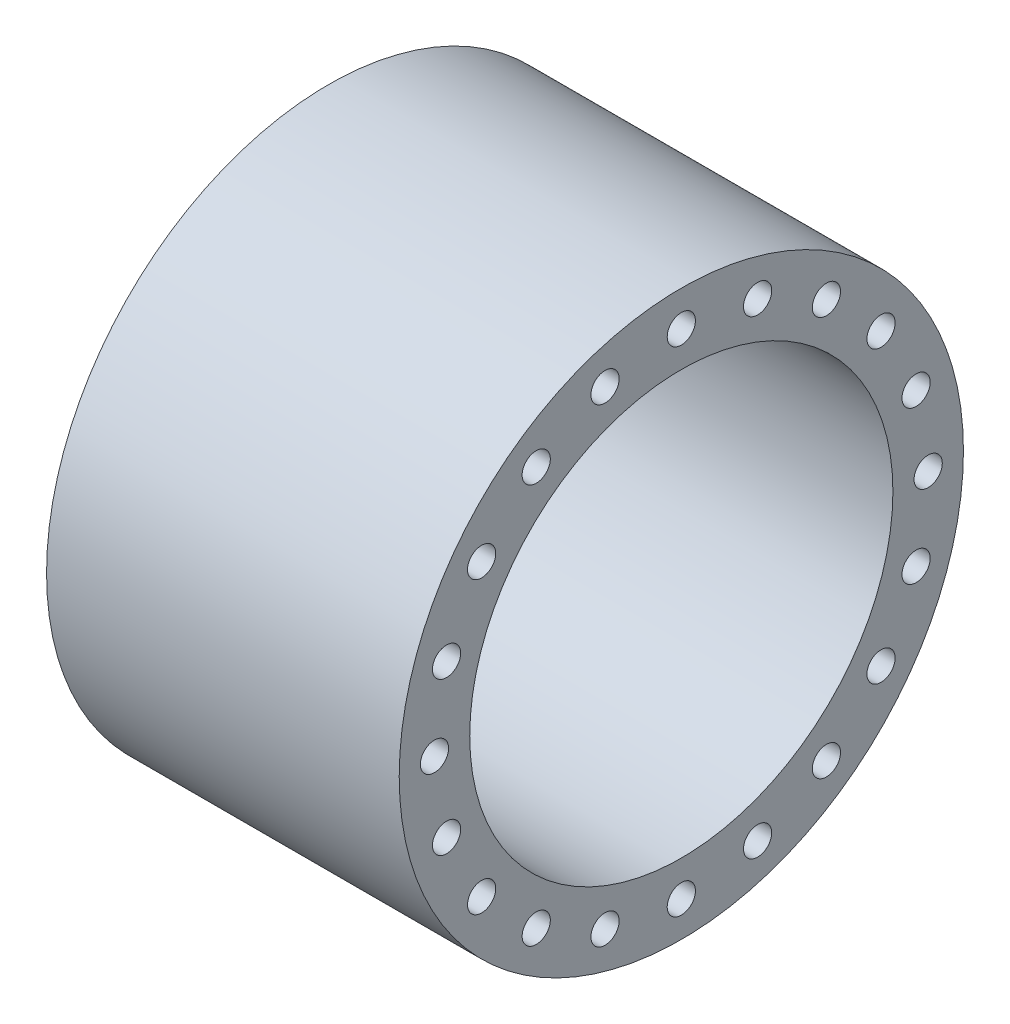
ISO-10303-21;
HEADER;
FILE_DESCRIPTION(('STEP AP214'),'2;1');
FILE_NAME('part.step','',(''),(''),'','','');
FILE_SCHEMA(('AUTOMOTIVE_DESIGN { 1 0 10303 214 1 1 1 1 }'));
ENDSEC;
DATA;
#1=APPLICATION_CONTEXT('core data for automotive mechanical design processes');
#2=APPLICATION_PROTOCOL_DEFINITION('international standard','automotive_design',2000,#1);
#3=PRODUCT_CONTEXT('',#1,'mechanical');
#4=PRODUCT('Part','Part','',(#3));
#5=PRODUCT_RELATED_PRODUCT_CATEGORY('part','',(#4));
#6=PRODUCT_DEFINITION_FORMATION('','',#4);
#7=PRODUCT_DEFINITION_CONTEXT('part definition',#1,'design');
#8=PRODUCT_DEFINITION('design','',#6,#7);
#9=PRODUCT_DEFINITION_SHAPE('','',#8);
#10=(LENGTH_UNIT() NAMED_UNIT(*) SI_UNIT(.MILLI.,.METRE.));
#11=(NAMED_UNIT(*) PLANE_ANGLE_UNIT() SI_UNIT($,.RADIAN.));
#12=(NAMED_UNIT(*) SI_UNIT($,.STERADIAN.) SOLID_ANGLE_UNIT());
#13=UNCERTAINTY_MEASURE_WITH_UNIT(LENGTH_MEASURE(1.E-05),#10,'distance_accuracy_value','');
#14=(GEOMETRIC_REPRESENTATION_CONTEXT(3) GLOBAL_UNCERTAINTY_ASSIGNED_CONTEXT((#13)) GLOBAL_UNIT_ASSIGNED_CONTEXT((#10,
#11,#12)) REPRESENTATION_CONTEXT('',''));
#15=CARTESIAN_POINT('',(0.,0.,0.));
#16=DIRECTION('',(0.,0.,1.));
#17=DIRECTION('',(1.,0.,0.));
#18=AXIS2_PLACEMENT_3D('',#15,#16,#17);
#19=CARTESIAN_POINT('',(50.,0.,0.));
#20=DIRECTION('',(1.,0.,0.));
#21=DIRECTION('',(0.,0.,1.));
#22=AXIS2_PLACEMENT_3D('',#19,#20,#21);
#23=PLANE('',#22);
#24=CARTESIAN_POINT('',(50.,66.573956140661,-21.6311896062454));
#25=DIRECTION('',(-1.,0.,0.));
#26=DIRECTION('',(0.,0.309016994374935,0.951056516295158));
#27=AXIS2_PLACEMENT_3D('',#24,#25,#26);
#28=CIRCLE('',#27,4.);
#29=CARTESIAN_POINT('',(50.,67.8100241181608,-17.8269635410648));
#30=VERTEX_POINT('',#29);
#31=EDGE_CURVE('E175',#30,#30,#28,.T.);
#32=ORIENTED_EDGE('',*,*,#31,.T.);
#33=EDGE_LOOP('',(#32));
#34=FACE_BOUND('',#33,.T.);
#35=CARTESIAN_POINT('',(50.,56.6311896062469,-41.1449676604724));
#36=DIRECTION('',(-1.,0.,0.));
#37=DIRECTION('',(0.,0.587785252292462,0.809016994374955));
#38=AXIS2_PLACEMENT_3D('',#35,#36,#37);
#39=CIRCLE('',#38,4.);
#40=CARTESIAN_POINT('',(50.,58.9823306154167,-37.9088996829726));
#41=VERTEX_POINT('',#40);
#42=EDGE_CURVE('E169',#41,#41,#39,.T.);
#43=ORIENTED_EDGE('',*,*,#42,.T.);
#44=EDGE_LOOP('',(#43));
#45=FACE_BOUND('',#44,.T.);
#46=CARTESIAN_POINT('',(50.,41.1449676604738,-56.6311896062458));
#47=DIRECTION('',(-1.,0.,0.));
#48=DIRECTION('',(0.,0.80901699437494,0.587785252292483));
#49=AXIS2_PLACEMENT_3D('',#46,#47,#48);
#50=CIRCLE('',#49,4.);
#51=CARTESIAN_POINT('',(50.,44.3810356379736,-54.2800485970759));
#52=VERTEX_POINT('',#51);
#53=EDGE_CURVE('E163',#52,#52,#50,.T.);
#54=ORIENTED_EDGE('',*,*,#53,.T.);
#55=EDGE_LOOP('',(#54));
#56=FACE_BOUND('',#55,.T.);
#57=CARTESIAN_POINT('',(50.,21.6311896062471,-66.5739561406605));
#58=DIRECTION('',(-1.,0.,0.));
#59=DIRECTION('',(0.,0.95105651629515,0.309016994374958));
#60=AXIS2_PLACEMENT_3D('',#57,#58,#59);
#61=CIRCLE('',#60,4.);
#62=CARTESIAN_POINT('',(50.,25.4354156714277,-65.3378881631607));
#63=VERTEX_POINT('',#62);
#64=EDGE_CURVE('E157',#63,#63,#61,.T.);
#65=ORIENTED_EDGE('',*,*,#64,.T.);
#66=EDGE_LOOP('',(#65));
#67=FACE_BOUND('',#66,.T.);
#68=CARTESIAN_POINT('',(50.,7.368850215545E-13,-70.));
#69=DIRECTION('',(-1.,0.,0.));
#70=DIRECTION('',(0.,1.,0.));
#71=AXIS2_PLACEMENT_3D('',#68,#69,#70);
#72=CIRCLE('',#71,4.);
#73=CARTESIAN_POINT('',(50.,4.00000000000074,-70.));
#74=VERTEX_POINT('',#73);
#75=EDGE_CURVE('E151',#74,#74,#72,.T.);
#76=ORIENTED_EDGE('',*,*,#75,.T.);
#77=EDGE_LOOP('',(#76));
#78=FACE_BOUND('',#77,.T.);
#79=CARTESIAN_POINT('',(50.,-21.6311896062457,-66.573956140661));
#80=DIRECTION('',(-1.,0.,0.));
#81=DIRECTION('',(0.,0.951056516295157,-0.309016994374938));
#82=AXIS2_PLACEMENT_3D('',#79,#80,#81);
#83=CIRCLE('',#82,4.);
#84=CARTESIAN_POINT('',(50.,-17.8269635410651,-67.8100241181607));
#85=VERTEX_POINT('',#84);
#86=EDGE_CURVE('E145',#85,#85,#83,.T.);
#87=ORIENTED_EDGE('',*,*,#86,.T.);
#88=EDGE_LOOP('',(#87));
#89=FACE_BOUND('',#88,.T.);
#90=CARTESIAN_POINT('',(50.,-41.1449676604726,-56.6311896062467));
#91=DIRECTION('',(-1.,0.,0.));
#92=DIRECTION('',(0.,0.809016994374953,-0.587785252292465));
#93=AXIS2_PLACEMENT_3D('',#90,#91,#92);
#94=CIRCLE('',#93,4.);
#95=CARTESIAN_POINT('',(50.,-37.9088996829728,-58.9823306154166));
#96=VERTEX_POINT('',#95);
#97=EDGE_CURVE('E139',#96,#96,#94,.T.);
#98=ORIENTED_EDGE('',*,*,#97,.T.);
#99=EDGE_LOOP('',(#98));
#100=FACE_BOUND('',#99,.T.);
#101=CARTESIAN_POINT('',(50.,-56.631189606246,-41.1449676604736));
#102=DIRECTION('',(-1.,0.,0.));
#103=DIRECTION('',(0.,0.58778525229248,-0.809016994374942));
#104=AXIS2_PLACEMENT_3D('',#101,#102,#103);
#105=CIRCLE('',#104,4.);
#106=CARTESIAN_POINT('',(50.,-54.280048597076,-44.3810356379734));
#107=VERTEX_POINT('',#106);
#108=EDGE_CURVE('E133',#107,#107,#105,.T.);
#109=ORIENTED_EDGE('',*,*,#108,.T.);
#110=EDGE_LOOP('',(#109));
#111=FACE_BOUND('',#110,.T.);
#112=CARTESIAN_POINT('',(50.,-66.5739561406606,-21.6311896062468));
#113=DIRECTION('',(-1.,0.,0.));
#114=DIRECTION('',(0.,0.309016994374955,-0.951056516295151));
#115=AXIS2_PLACEMENT_3D('',#112,#113,#114);
#116=CIRCLE('',#115,4.);
#117=CARTESIAN_POINT('',(50.,-65.3378881631608,-25.4354156714274));
#118=VERTEX_POINT('',#117);
#119=EDGE_CURVE('E127',#118,#118,#116,.T.);
#120=ORIENTED_EDGE('',*,*,#119,.T.);
#121=EDGE_LOOP('',(#120));
#122=FACE_BOUND('',#121,.T.);
#123=CARTESIAN_POINT('',(50.,-70.,0.));
#124=DIRECTION('',(-1.,0.,0.));
#125=DIRECTION('',(0.,0.,-1.));
#126=AXIS2_PLACEMENT_3D('',#123,#124,#125);
#127=CIRCLE('',#126,4.);
#128=CARTESIAN_POINT('',(50.,-70.,-4.00000000000001));
#129=VERTEX_POINT('',#128);
#130=EDGE_CURVE('E121',#129,#129,#127,.T.);
#131=ORIENTED_EDGE('',*,*,#130,.T.);
#132=EDGE_LOOP('',(#131));
#133=FACE_BOUND('',#132,.T.);
#134=CARTESIAN_POINT('',(50.,-66.5739561406609,21.6311896062459));
#135=DIRECTION('',(-1.,0.,0.));
#136=DIRECTION('',(0.,-0.309016994374941,-0.951056516295156));
#137=AXIS2_PLACEMENT_3D('',#134,#135,#136);
#138=CIRCLE('',#137,4.);
#139=CARTESIAN_POINT('',(50.,-67.8100241181607,17.8269635410653));
#140=VERTEX_POINT('',#139);
#141=EDGE_CURVE('E115',#140,#140,#138,.T.);
#142=ORIENTED_EDGE('',*,*,#141,.T.);
#143=EDGE_LOOP('',(#142));
#144=FACE_BOUND('',#143,.T.);
#145=CARTESIAN_POINT('',(50.,-56.6311896062466,41.1449676604728));
#146=DIRECTION('',(-1.,0.,0.));
#147=DIRECTION('',(0.,-0.587785252292469,-0.809016994374951));
#148=AXIS2_PLACEMENT_3D('',#145,#146,#147);
#149=CIRCLE('',#148,4.);
#150=CARTESIAN_POINT('',(50.,-58.9823306154164,37.908899682973));
#151=VERTEX_POINT('',#150);
#152=EDGE_CURVE('E109',#151,#151,#149,.T.);
#153=ORIENTED_EDGE('',*,*,#152,.T.);
#154=EDGE_LOOP('',(#153));
#155=FACE_BOUND('',#154,.T.);
#156=CARTESIAN_POINT('',(50.,-41.1449676604734,56.6311896062461));
#157=DIRECTION('',(-1.,0.,0.));
#158=DIRECTION('',(0.,-0.809016994374945,-0.587785252292477));
#159=AXIS2_PLACEMENT_3D('',#156,#157,#158);
#160=CIRCLE('',#159,4.);
#161=CARTESIAN_POINT('',(50.,-44.3810356379732,54.2800485970762));
#162=VERTEX_POINT('',#161);
#163=EDGE_CURVE('E103',#162,#162,#160,.T.);
#164=ORIENTED_EDGE('',*,*,#163,.T.);
#165=EDGE_LOOP('',(#164));
#166=FACE_BOUND('',#165,.T.);
#167=CARTESIAN_POINT('',(50.,-21.6311896062466,66.5739561406607));
#168=DIRECTION('',(-1.,0.,0.));
#169=DIRECTION('',(0.,-0.951056516295152,-0.309016994374952));
#170=AXIS2_PLACEMENT_3D('',#167,#168,#169);
#171=CIRCLE('',#170,4.);
#172=CARTESIAN_POINT('',(50.,-25.4354156714272,65.3378881631609));
#173=VERTEX_POINT('',#172);
#174=EDGE_CURVE('E97',#173,#173,#171,.T.);
#175=ORIENTED_EDGE('',*,*,#174,.T.);
#176=EDGE_LOOP('',(#175));
#177=FACE_BOUND('',#176,.T.);
#178=CARTESIAN_POINT('',(50.,-2.48077634116461E-13,70.));
#179=DIRECTION('',(-1.,0.,0.));
#180=DIRECTION('',(0.,-1.,0.));
#181=AXIS2_PLACEMENT_3D('',#178,#179,#180);
#182=CIRCLE('',#181,4.);
#183=CARTESIAN_POINT('',(50.,-4.00000000000025,70.));
#184=VERTEX_POINT('',#183);
#185=EDGE_CURVE('E90',#184,#184,#182,.T.);
#186=ORIENTED_EDGE('',*,*,#185,.T.);
#187=EDGE_LOOP('',(#186));
#188=FACE_BOUND('',#187,.T.);
#189=CARTESIAN_POINT('',(50.,21.6311896062461,66.5739561406608));
#190=DIRECTION('',(-1.,0.,0.));
#191=DIRECTION('',(0.,-0.951056516295155,0.309016994374945));
#192=AXIS2_PLACEMENT_3D('',#189,#190,#191);
#193=CIRCLE('',#192,4.);
#194=CARTESIAN_POINT('',(50.,17.8269635410655,67.8100241181606));
#195=VERTEX_POINT('',#194);
#196=EDGE_CURVE('E84',#195,#195,#193,.T.);
#197=ORIENTED_EDGE('',*,*,#196,.T.);
#198=EDGE_LOOP('',(#197));
#199=FACE_BOUND('',#198,.T.);
#200=CARTESIAN_POINT('',(50.,41.144967660473,56.6311896062464));
#201=DIRECTION('',(-1.,0.,0.));
#202=DIRECTION('',(0.,-0.809016994374949,0.587785252292471));
#203=AXIS2_PLACEMENT_3D('',#200,#201,#202);
#204=CIRCLE('',#203,4.);
#205=CARTESIAN_POINT('',(50.,37.9088996829732,58.9823306154163));
#206=VERTEX_POINT('',#205);
#207=EDGE_CURVE('E77',#206,#206,#204,.T.);
#208=ORIENTED_EDGE('',*,*,#207,.T.);
#209=EDGE_LOOP('',(#208));
#210=FACE_BOUND('',#209,.T.);
#211=CARTESIAN_POINT('',(50.,56.6311896062463,41.1449676604732));
#212=DIRECTION('',(-1.,0.,0.));
#213=DIRECTION('',(0.,-0.587785252292474,0.809016994374947));
#214=AXIS2_PLACEMENT_3D('',#211,#212,#213);
#215=CIRCLE('',#214,4.);
#216=CARTESIAN_POINT('',(50.,54.2800485970764,44.381035637973));
#217=VERTEX_POINT('',#216);
#218=EDGE_CURVE('E71',#217,#217,#215,.T.);
#219=ORIENTED_EDGE('',*,*,#218,.T.);
#220=EDGE_LOOP('',(#219));
#221=FACE_BOUND('',#220,.T.);
#222=CARTESIAN_POINT('',(50.,66.5739561406608,21.6311896062464));
#223=DIRECTION('',(-1.,0.,0.));
#224=DIRECTION('',(0.,-0.309016994374948,0.951056516295154));
#225=AXIS2_PLACEMENT_3D('',#222,#223,#224);
#226=CIRCLE('',#225,4.);
#227=CARTESIAN_POINT('',(50.,65.337888163161,25.435415671427));
#228=VERTEX_POINT('',#227);
#229=EDGE_CURVE('E65',#228,#228,#226,.T.);
#230=ORIENTED_EDGE('',*,*,#229,.T.);
#231=EDGE_LOOP('',(#230));
#232=FACE_BOUND('',#231,.T.);
#233=CARTESIAN_POINT('',(50.,70.,0.));
#234=DIRECTION('',(-1.,0.,0.));
#235=DIRECTION('',(0.,0.,1.));
#236=AXIS2_PLACEMENT_3D('',#233,#234,#235);
#237=CIRCLE('',#236,4.);
#238=CARTESIAN_POINT('',(50.,70.,4.00000000000001));
#239=VERTEX_POINT('',#238);
#240=EDGE_CURVE('E59',#239,#239,#237,.T.);
#241=ORIENTED_EDGE('',*,*,#240,.T.);
#242=EDGE_LOOP('',(#241));
#243=FACE_BOUND('',#242,.T.);
#244=CARTESIAN_POINT('',(50.,0.,0.));
#245=DIRECTION('',(-1.,0.,0.));
#246=DIRECTION('',(0.,0.,1.));
#247=AXIS2_PLACEMENT_3D('',#244,#245,#246);
#248=CIRCLE('',#247,80.);
#249=CARTESIAN_POINT('',(50.,0.,80.));
#250=VERTEX_POINT('',#249);
#251=EDGE_CURVE('E10',#250,#250,#248,.T.);
#252=ORIENTED_EDGE('',*,*,#251,.F.);
#253=EDGE_LOOP('',(#252));
#254=FACE_BOUND('',#253,.T.);
#255=CARTESIAN_POINT('',(50.,0.,0.));
#256=DIRECTION('',(-1.,0.,0.));
#257=DIRECTION('',(0.,0.,1.));
#258=AXIS2_PLACEMENT_3D('',#255,#256,#257);
#259=CIRCLE('',#258,60.);
#260=CARTESIAN_POINT('',(50.,0.,60.));
#261=VERTEX_POINT('',#260);
#262=EDGE_CURVE('E51',#261,#261,#259,.T.);
#263=ORIENTED_EDGE('',*,*,#262,.T.);
#264=EDGE_LOOP('',(#263));
#265=FACE_BOUND('',#264,.T.);
#266=ADVANCED_FACE('F37',(#34,#45,#56,#67,#78,#89,#100,#111,#122,#133,#144,#155,#166,#177,#188,
#199,#210,#221,#232,#243,#254,#265),#23,.T.);
#267=CARTESIAN_POINT('',(-50.,0.,0.));
#268=DIRECTION('',(1.,0.,0.));
#269=DIRECTION('',(0.,0.,1.));
#270=AXIS2_PLACEMENT_3D('',#267,#268,#269);
#271=PLANE('',#270);
#272=CARTESIAN_POINT('',(-50.,66.573956140661,-21.6311896062454));
#273=DIRECTION('',(-1.,0.,0.));
#274=DIRECTION('',(0.,0.309016994374935,0.951056516295158));
#275=AXIS2_PLACEMENT_3D('',#272,#273,#274);
#276=CIRCLE('',#275,4.);
#277=CARTESIAN_POINT('',(-50.,67.8100241181608,-17.8269635410648));
#278=VERTEX_POINT('',#277);
#279=EDGE_CURVE('E172',#278,#278,#276,.T.);
#280=ORIENTED_EDGE('',*,*,#279,.F.);
#281=EDGE_LOOP('',(#280));
#282=FACE_BOUND('',#281,.T.);
#283=CARTESIAN_POINT('',(-50.,56.6311896062469,-41.1449676604724));
#284=DIRECTION('',(-1.,0.,0.));
#285=DIRECTION('',(0.,0.587785252292462,0.809016994374955));
#286=AXIS2_PLACEMENT_3D('',#283,#284,#285);
#287=CIRCLE('',#286,4.);
#288=CARTESIAN_POINT('',(-50.,58.9823306154167,-37.9088996829726));
#289=VERTEX_POINT('',#288);
#290=EDGE_CURVE('E166',#289,#289,#287,.T.);
#291=ORIENTED_EDGE('',*,*,#290,.F.);
#292=EDGE_LOOP('',(#291));
#293=FACE_BOUND('',#292,.T.);
#294=CARTESIAN_POINT('',(-50.,41.1449676604738,-56.6311896062458));
#295=DIRECTION('',(-1.,0.,0.));
#296=DIRECTION('',(0.,0.80901699437494,0.587785252292483));
#297=AXIS2_PLACEMENT_3D('',#294,#295,#296);
#298=CIRCLE('',#297,4.);
#299=CARTESIAN_POINT('',(-50.,44.3810356379736,-54.2800485970759));
#300=VERTEX_POINT('',#299);
#301=EDGE_CURVE('E160',#300,#300,#298,.T.);
#302=ORIENTED_EDGE('',*,*,#301,.F.);
#303=EDGE_LOOP('',(#302));
#304=FACE_BOUND('',#303,.T.);
#305=CARTESIAN_POINT('',(-50.,21.6311896062471,-66.5739561406605));
#306=DIRECTION('',(-1.,0.,0.));
#307=DIRECTION('',(0.,0.95105651629515,0.309016994374958));
#308=AXIS2_PLACEMENT_3D('',#305,#306,#307);
#309=CIRCLE('',#308,4.);
#310=CARTESIAN_POINT('',(-50.,25.4354156714277,-65.3378881631607));
#311=VERTEX_POINT('',#310);
#312=EDGE_CURVE('E154',#311,#311,#309,.T.);
#313=ORIENTED_EDGE('',*,*,#312,.F.);
#314=EDGE_LOOP('',(#313));
#315=FACE_BOUND('',#314,.T.);
#316=CARTESIAN_POINT('',(-50.,7.368850215545E-13,-70.));
#317=DIRECTION('',(-1.,0.,0.));
#318=DIRECTION('',(0.,1.,0.));
#319=AXIS2_PLACEMENT_3D('',#316,#317,#318);
#320=CIRCLE('',#319,4.);
#321=CARTESIAN_POINT('',(-50.,4.00000000000074,-70.));
#322=VERTEX_POINT('',#321);
#323=EDGE_CURVE('E148',#322,#322,#320,.T.);
#324=ORIENTED_EDGE('',*,*,#323,.F.);
#325=EDGE_LOOP('',(#324));
#326=FACE_BOUND('',#325,.T.);
#327=CARTESIAN_POINT('',(-50.,-21.6311896062457,-66.573956140661));
#328=DIRECTION('',(-1.,0.,0.));
#329=DIRECTION('',(0.,0.951056516295157,-0.309016994374938));
#330=AXIS2_PLACEMENT_3D('',#327,#328,#329);
#331=CIRCLE('',#330,4.);
#332=CARTESIAN_POINT('',(-50.,-17.8269635410651,-67.8100241181607));
#333=VERTEX_POINT('',#332);
#334=EDGE_CURVE('E142',#333,#333,#331,.T.);
#335=ORIENTED_EDGE('',*,*,#334,.F.);
#336=EDGE_LOOP('',(#335));
#337=FACE_BOUND('',#336,.T.);
#338=CARTESIAN_POINT('',(-50.,-41.1449676604726,-56.6311896062467));
#339=DIRECTION('',(-1.,0.,0.));
#340=DIRECTION('',(0.,0.809016994374953,-0.587785252292465));
#341=AXIS2_PLACEMENT_3D('',#338,#339,#340);
#342=CIRCLE('',#341,4.);
#343=CARTESIAN_POINT('',(-50.,-37.9088996829728,-58.9823306154166));
#344=VERTEX_POINT('',#343);
#345=EDGE_CURVE('E136',#344,#344,#342,.T.);
#346=ORIENTED_EDGE('',*,*,#345,.F.);
#347=EDGE_LOOP('',(#346));
#348=FACE_BOUND('',#347,.T.);
#349=CARTESIAN_POINT('',(-50.,-56.631189606246,-41.1449676604736));
#350=DIRECTION('',(-1.,0.,0.));
#351=DIRECTION('',(0.,0.58778525229248,-0.809016994374942));
#352=AXIS2_PLACEMENT_3D('',#349,#350,#351);
#353=CIRCLE('',#352,4.);
#354=CARTESIAN_POINT('',(-50.,-54.280048597076,-44.3810356379734));
#355=VERTEX_POINT('',#354);
#356=EDGE_CURVE('E130',#355,#355,#353,.T.);
#357=ORIENTED_EDGE('',*,*,#356,.F.);
#358=EDGE_LOOP('',(#357));
#359=FACE_BOUND('',#358,.T.);
#360=CARTESIAN_POINT('',(-50.,-66.5739561406606,-21.6311896062468));
#361=DIRECTION('',(-1.,0.,0.));
#362=DIRECTION('',(0.,0.309016994374955,-0.951056516295151));
#363=AXIS2_PLACEMENT_3D('',#360,#361,#362);
#364=CIRCLE('',#363,4.);
#365=CARTESIAN_POINT('',(-50.,-65.3378881631608,-25.4354156714274));
#366=VERTEX_POINT('',#365);
#367=EDGE_CURVE('E124',#366,#366,#364,.T.);
#368=ORIENTED_EDGE('',*,*,#367,.F.);
#369=EDGE_LOOP('',(#368));
#370=FACE_BOUND('',#369,.T.);
#371=CARTESIAN_POINT('',(-50.,-70.,0.));
#372=DIRECTION('',(-1.,0.,0.));
#373=DIRECTION('',(0.,0.,-1.));
#374=AXIS2_PLACEMENT_3D('',#371,#372,#373);
#375=CIRCLE('',#374,4.);
#376=CARTESIAN_POINT('',(-50.,-70.,-4.00000000000001));
#377=VERTEX_POINT('',#376);
#378=EDGE_CURVE('E118',#377,#377,#375,.T.);
#379=ORIENTED_EDGE('',*,*,#378,.F.);
#380=EDGE_LOOP('',(#379));
#381=FACE_BOUND('',#380,.T.);
#382=CARTESIAN_POINT('',(-50.,-66.5739561406609,21.6311896062459));
#383=DIRECTION('',(-1.,0.,0.));
#384=DIRECTION('',(0.,-0.309016994374941,-0.951056516295156));
#385=AXIS2_PLACEMENT_3D('',#382,#383,#384);
#386=CIRCLE('',#385,4.);
#387=CARTESIAN_POINT('',(-50.,-67.8100241181607,17.8269635410653));
#388=VERTEX_POINT('',#387);
#389=EDGE_CURVE('E112',#388,#388,#386,.T.);
#390=ORIENTED_EDGE('',*,*,#389,.F.);
#391=EDGE_LOOP('',(#390));
#392=FACE_BOUND('',#391,.T.);
#393=CARTESIAN_POINT('',(-50.,-56.6311896062466,41.1449676604728));
#394=DIRECTION('',(-1.,0.,0.));
#395=DIRECTION('',(0.,-0.587785252292469,-0.809016994374951));
#396=AXIS2_PLACEMENT_3D('',#393,#394,#395);
#397=CIRCLE('',#396,4.);
#398=CARTESIAN_POINT('',(-50.,-58.9823306154164,37.908899682973));
#399=VERTEX_POINT('',#398);
#400=EDGE_CURVE('E106',#399,#399,#397,.T.);
#401=ORIENTED_EDGE('',*,*,#400,.F.);
#402=EDGE_LOOP('',(#401));
#403=FACE_BOUND('',#402,.T.);
#404=CARTESIAN_POINT('',(-50.,-41.1449676604734,56.6311896062461));
#405=DIRECTION('',(-1.,0.,0.));
#406=DIRECTION('',(0.,-0.809016994374945,-0.587785252292477));
#407=AXIS2_PLACEMENT_3D('',#404,#405,#406);
#408=CIRCLE('',#407,4.);
#409=CARTESIAN_POINT('',(-50.,-44.3810356379732,54.2800485970762));
#410=VERTEX_POINT('',#409);
#411=EDGE_CURVE('E100',#410,#410,#408,.T.);
#412=ORIENTED_EDGE('',*,*,#411,.F.);
#413=EDGE_LOOP('',(#412));
#414=FACE_BOUND('',#413,.T.);
#415=CARTESIAN_POINT('',(-50.,-21.6311896062466,66.5739561406607));
#416=DIRECTION('',(-1.,0.,0.));
#417=DIRECTION('',(0.,-0.951056516295152,-0.309016994374952));
#418=AXIS2_PLACEMENT_3D('',#415,#416,#417);
#419=CIRCLE('',#418,4.);
#420=CARTESIAN_POINT('',(-50.,-25.4354156714272,65.3378881631609));
#421=VERTEX_POINT('',#420);
#422=EDGE_CURVE('E94',#421,#421,#419,.T.);
#423=ORIENTED_EDGE('',*,*,#422,.F.);
#424=EDGE_LOOP('',(#423));
#425=FACE_BOUND('',#424,.T.);
#426=CARTESIAN_POINT('',(-50.,-2.48077634116461E-13,70.));
#427=DIRECTION('',(-1.,0.,0.));
#428=DIRECTION('',(0.,-1.,0.));
#429=AXIS2_PLACEMENT_3D('',#426,#427,#428);
#430=CIRCLE('',#429,4.);
#431=CARTESIAN_POINT('',(-50.,-4.00000000000025,70.));
#432=VERTEX_POINT('',#431);
#433=EDGE_CURVE('E87',#432,#432,#430,.T.);
#434=ORIENTED_EDGE('',*,*,#433,.F.);
#435=EDGE_LOOP('',(#434));
#436=FACE_BOUND('',#435,.T.);
#437=CARTESIAN_POINT('',(-50.,21.6311896062461,66.5739561406608));
#438=DIRECTION('',(-1.,0.,0.));
#439=DIRECTION('',(0.,-0.951056516295155,0.309016994374945));
#440=AXIS2_PLACEMENT_3D('',#437,#438,#439);
#441=CIRCLE('',#440,4.);
#442=CARTESIAN_POINT('',(-50.,17.8269635410655,67.8100241181606));
#443=VERTEX_POINT('',#442);
#444=EDGE_CURVE('E81',#443,#443,#441,.T.);
#445=ORIENTED_EDGE('',*,*,#444,.F.);
#446=EDGE_LOOP('',(#445));
#447=FACE_BOUND('',#446,.T.);
#448=CARTESIAN_POINT('',(-50.,41.144967660473,56.6311896062464));
#449=DIRECTION('',(-1.,0.,0.));
#450=DIRECTION('',(0.,-0.809016994374949,0.587785252292471));
#451=AXIS2_PLACEMENT_3D('',#448,#449,#450);
#452=CIRCLE('',#451,4.);
#453=CARTESIAN_POINT('',(-50.,37.9088996829732,58.9823306154163));
#454=VERTEX_POINT('',#453);
#455=EDGE_CURVE('E74',#454,#454,#452,.T.);
#456=ORIENTED_EDGE('',*,*,#455,.F.);
#457=EDGE_LOOP('',(#456));
#458=FACE_BOUND('',#457,.T.);
#459=CARTESIAN_POINT('',(-50.,56.6311896062463,41.1449676604732));
#460=DIRECTION('',(-1.,0.,0.));
#461=DIRECTION('',(0.,-0.587785252292474,0.809016994374947));
#462=AXIS2_PLACEMENT_3D('',#459,#460,#461);
#463=CIRCLE('',#462,4.);
#464=CARTESIAN_POINT('',(-50.,54.2800485970764,44.381035637973));
#465=VERTEX_POINT('',#464);
#466=EDGE_CURVE('E68',#465,#465,#463,.T.);
#467=ORIENTED_EDGE('',*,*,#466,.F.);
#468=EDGE_LOOP('',(#467));
#469=FACE_BOUND('',#468,.T.);
#470=CARTESIAN_POINT('',(-50.,66.5739561406608,21.6311896062464));
#471=DIRECTION('',(-1.,0.,0.));
#472=DIRECTION('',(0.,-0.309016994374948,0.951056516295154));
#473=AXIS2_PLACEMENT_3D('',#470,#471,#472);
#474=CIRCLE('',#473,4.);
#475=CARTESIAN_POINT('',(-50.,65.337888163161,25.435415671427));
#476=VERTEX_POINT('',#475);
#477=EDGE_CURVE('E62',#476,#476,#474,.T.);
#478=ORIENTED_EDGE('',*,*,#477,.F.);
#479=EDGE_LOOP('',(#478));
#480=FACE_BOUND('',#479,.T.);
#481=CARTESIAN_POINT('',(-50.,70.,0.));
#482=DIRECTION('',(-1.,0.,0.));
#483=DIRECTION('',(0.,0.,1.));
#484=AXIS2_PLACEMENT_3D('',#481,#482,#483);
#485=CIRCLE('',#484,4.);
#486=CARTESIAN_POINT('',(-50.,70.,4.00000000000001));
#487=VERTEX_POINT('',#486);
#488=EDGE_CURVE('E56',#487,#487,#485,.T.);
#489=ORIENTED_EDGE('',*,*,#488,.F.);
#490=EDGE_LOOP('',(#489));
#491=FACE_BOUND('',#490,.T.);
#492=CARTESIAN_POINT('',(-50.,0.,0.));
#493=DIRECTION('',(-1.,0.,0.));
#494=DIRECTION('',(0.,0.,1.));
#495=AXIS2_PLACEMENT_3D('',#492,#493,#494);
#496=CIRCLE('',#495,80.);
#497=CARTESIAN_POINT('',(-50.,0.,80.));
#498=VERTEX_POINT('',#497);
#499=EDGE_CURVE('E41',#498,#498,#496,.T.);
#500=ORIENTED_EDGE('',*,*,#499,.T.);
#501=EDGE_LOOP('',(#500));
#502=FACE_BOUND('',#501,.T.);
#503=CARTESIAN_POINT('',(-50.,0.,0.));
#504=DIRECTION('',(-1.,0.,0.));
#505=DIRECTION('',(0.,0.,1.));
#506=AXIS2_PLACEMENT_3D('',#503,#504,#505);
#507=CIRCLE('',#506,60.);
#508=CARTESIAN_POINT('',(-50.,0.,60.));
#509=VERTEX_POINT('',#508);
#510=EDGE_CURVE('E53',#509,#509,#507,.T.);
#511=ORIENTED_EDGE('',*,*,#510,.F.);
#512=EDGE_LOOP('',(#511));
#513=FACE_BOUND('',#512,.T.);
#514=ADVANCED_FACE('F184',(#282,#293,#304,#315,#326,#337,#348,#359,#370,#381,#392,#403,#414,
#425,#436,#447,#458,#469,#480,#491,#502,#513),#271,.F.);
#515=CARTESIAN_POINT('',(50.,0.,0.));
#516=DIRECTION('',(-1.,0.,0.));
#517=DIRECTION('',(0.,0.,-1.));
#518=AXIS2_PLACEMENT_3D('',#515,#516,#517);
#519=CYLINDRICAL_SURFACE('',#518,80.);
#520=ORIENTED_EDGE('',*,*,#251,.T.);
#521=EDGE_LOOP('',(#520));
#522=FACE_BOUND('',#521,.T.);
#523=ORIENTED_EDGE('',*,*,#499,.F.);
#524=EDGE_LOOP('',(#523));
#525=FACE_BOUND('',#524,.T.);
#526=ADVANCED_FACE('F39',(#522,#525),#519,.T.);
#527=CARTESIAN_POINT('',(50.,0.,0.));
#528=DIRECTION('',(-1.,0.,0.));
#529=DIRECTION('',(0.,0.,-1.));
#530=AXIS2_PLACEMENT_3D('',#527,#528,#529);
#531=CYLINDRICAL_SURFACE('',#530,60.);
#532=ORIENTED_EDGE('',*,*,#262,.F.);
#533=EDGE_LOOP('',(#532));
#534=FACE_BOUND('',#533,.T.);
#535=ORIENTED_EDGE('',*,*,#510,.T.);
#536=EDGE_LOOP('',(#535));
#537=FACE_BOUND('',#536,.T.);
#538=ADVANCED_FACE('F229',(#534,#537),#531,.F.);
#539=CARTESIAN_POINT('',(-50.,70.,0.));
#540=DIRECTION('',(1.,0.,0.));
#541=DIRECTION('',(0.,0.,1.));
#542=AXIS2_PLACEMENT_3D('',#539,#540,#541);
#543=CYLINDRICAL_SURFACE('',#542,4.);
#544=ORIENTED_EDGE('',*,*,#488,.T.);
#545=EDGE_LOOP('',(#544));
#546=FACE_BOUND('',#545,.T.);
#547=ORIENTED_EDGE('',*,*,#240,.F.);
#548=EDGE_LOOP('',(#547));
#549=FACE_BOUND('',#548,.T.);
#550=ADVANCED_FACE('F231',(#546,#549),#543,.F.);
#551=CARTESIAN_POINT('',(-50.,66.5739561406608,21.6311896062464));
#552=DIRECTION('',(1.,0.,0.));
#553=DIRECTION('',(0.,0.,1.));
#554=AXIS2_PLACEMENT_3D('',#551,#552,#553);
#555=CYLINDRICAL_SURFACE('',#554,4.);
#556=ORIENTED_EDGE('',*,*,#477,.T.);
#557=EDGE_LOOP('',(#556));
#558=FACE_BOUND('',#557,.T.);
#559=ORIENTED_EDGE('',*,*,#229,.F.);
#560=EDGE_LOOP('',(#559));
#561=FACE_BOUND('',#560,.T.);
#562=ADVANCED_FACE('F238',(#558,#561),#555,.F.);
#563=CARTESIAN_POINT('',(-50.,56.6311896062463,41.1449676604732));
#564=DIRECTION('',(1.,0.,0.));
#565=DIRECTION('',(0.,0.,1.));
#566=AXIS2_PLACEMENT_3D('',#563,#564,#565);
#567=CYLINDRICAL_SURFACE('',#566,4.);
#568=ORIENTED_EDGE('',*,*,#466,.T.);
#569=EDGE_LOOP('',(#568));
#570=FACE_BOUND('',#569,.T.);
#571=ORIENTED_EDGE('',*,*,#218,.F.);
#572=EDGE_LOOP('',(#571));
#573=FACE_BOUND('',#572,.T.);
#574=ADVANCED_FACE('F291',(#570,#573),#567,.F.);
#575=CARTESIAN_POINT('',(-50.,41.144967660473,56.6311896062464));
#576=DIRECTION('',(1.,0.,0.));
#577=DIRECTION('',(0.,0.,1.));
#578=AXIS2_PLACEMENT_3D('',#575,#576,#577);
#579=CYLINDRICAL_SURFACE('',#578,4.);
#580=ORIENTED_EDGE('',*,*,#455,.T.);
#581=EDGE_LOOP('',(#580));
#582=FACE_BOUND('',#581,.T.);
#583=ORIENTED_EDGE('',*,*,#207,.F.);
#584=EDGE_LOOP('',(#583));
#585=FACE_BOUND('',#584,.T.);
#586=ADVANCED_FACE('F297',(#582,#585),#579,.F.);
#587=CARTESIAN_POINT('',(-50.,21.6311896062461,66.5739561406608));
#588=DIRECTION('',(1.,0.,0.));
#589=DIRECTION('',(0.,0.,1.));
#590=AXIS2_PLACEMENT_3D('',#587,#588,#589);
#591=CYLINDRICAL_SURFACE('',#590,4.);
#592=ORIENTED_EDGE('',*,*,#444,.T.);
#593=EDGE_LOOP('',(#592));
#594=FACE_BOUND('',#593,.T.);
#595=ORIENTED_EDGE('',*,*,#196,.F.);
#596=EDGE_LOOP('',(#595));
#597=FACE_BOUND('',#596,.T.);
#598=ADVANCED_FACE('F303',(#594,#597),#591,.F.);
#599=CARTESIAN_POINT('',(-50.,-2.48077634116461E-13,70.));
#600=DIRECTION('',(1.,0.,0.));
#601=DIRECTION('',(0.,0.,1.));
#602=AXIS2_PLACEMENT_3D('',#599,#600,#601);
#603=CYLINDRICAL_SURFACE('',#602,4.);
#604=ORIENTED_EDGE('',*,*,#433,.T.);
#605=EDGE_LOOP('',(#604));
#606=FACE_BOUND('',#605,.T.);
#607=ORIENTED_EDGE('',*,*,#185,.F.);
#608=EDGE_LOOP('',(#607));
#609=FACE_BOUND('',#608,.T.);
#610=ADVANCED_FACE('F307',(#606,#609),#603,.F.);
#611=CARTESIAN_POINT('',(-50.,-21.6311896062466,66.5739561406607));
#612=DIRECTION('',(1.,0.,0.));
#613=DIRECTION('',(0.,0.,1.));
#614=AXIS2_PLACEMENT_3D('',#611,#612,#613);
#615=CYLINDRICAL_SURFACE('',#614,4.);
#616=ORIENTED_EDGE('',*,*,#422,.T.);
#617=EDGE_LOOP('',(#616));
#618=FACE_BOUND('',#617,.T.);
#619=ORIENTED_EDGE('',*,*,#174,.F.);
#620=EDGE_LOOP('',(#619));
#621=FACE_BOUND('',#620,.T.);
#622=ADVANCED_FACE('F311',(#618,#621),#615,.F.);
#623=CARTESIAN_POINT('',(-50.,-41.1449676604734,56.6311896062461));
#624=DIRECTION('',(1.,0.,0.));
#625=DIRECTION('',(0.,0.,1.));
#626=AXIS2_PLACEMENT_3D('',#623,#624,#625);
#627=CYLINDRICAL_SURFACE('',#626,4.);
#628=ORIENTED_EDGE('',*,*,#411,.T.);
#629=EDGE_LOOP('',(#628));
#630=FACE_BOUND('',#629,.T.);
#631=ORIENTED_EDGE('',*,*,#163,.F.);
#632=EDGE_LOOP('',(#631));
#633=FACE_BOUND('',#632,.T.);
#634=ADVANCED_FACE('F315',(#630,#633),#627,.F.);
#635=CARTESIAN_POINT('',(-50.,-56.6311896062466,41.1449676604728));
#636=DIRECTION('',(1.,0.,0.));
#637=DIRECTION('',(0.,0.,1.));
#638=AXIS2_PLACEMENT_3D('',#635,#636,#637);
#639=CYLINDRICAL_SURFACE('',#638,4.);
#640=ORIENTED_EDGE('',*,*,#400,.T.);
#641=EDGE_LOOP('',(#640));
#642=FACE_BOUND('',#641,.T.);
#643=ORIENTED_EDGE('',*,*,#152,.F.);
#644=EDGE_LOOP('',(#643));
#645=FACE_BOUND('',#644,.T.);
#646=ADVANCED_FACE('F319',(#642,#645),#639,.F.);
#647=CARTESIAN_POINT('',(-50.,-66.5739561406609,21.6311896062459));
#648=DIRECTION('',(1.,0.,0.));
#649=DIRECTION('',(0.,0.,1.));
#650=AXIS2_PLACEMENT_3D('',#647,#648,#649);
#651=CYLINDRICAL_SURFACE('',#650,4.);
#652=ORIENTED_EDGE('',*,*,#389,.T.);
#653=EDGE_LOOP('',(#652));
#654=FACE_BOUND('',#653,.T.);
#655=ORIENTED_EDGE('',*,*,#141,.F.);
#656=EDGE_LOOP('',(#655));
#657=FACE_BOUND('',#656,.T.);
#658=ADVANCED_FACE('F323',(#654,#657),#651,.F.);
#659=CARTESIAN_POINT('',(-50.,-70.,0.));
#660=DIRECTION('',(1.,0.,0.));
#661=DIRECTION('',(0.,0.,1.));
#662=AXIS2_PLACEMENT_3D('',#659,#660,#661);
#663=CYLINDRICAL_SURFACE('',#662,4.);
#664=ORIENTED_EDGE('',*,*,#378,.T.);
#665=EDGE_LOOP('',(#664));
#666=FACE_BOUND('',#665,.T.);
#667=ORIENTED_EDGE('',*,*,#130,.F.);
#668=EDGE_LOOP('',(#667));
#669=FACE_BOUND('',#668,.T.);
#670=ADVANCED_FACE('F327',(#666,#669),#663,.F.);
#671=CARTESIAN_POINT('',(-50.,-66.5739561406606,-21.6311896062468));
#672=DIRECTION('',(1.,0.,0.));
#673=DIRECTION('',(0.,0.,1.));
#674=AXIS2_PLACEMENT_3D('',#671,#672,#673);
#675=CYLINDRICAL_SURFACE('',#674,4.);
#676=ORIENTED_EDGE('',*,*,#367,.T.);
#677=EDGE_LOOP('',(#676));
#678=FACE_BOUND('',#677,.T.);
#679=ORIENTED_EDGE('',*,*,#119,.F.);
#680=EDGE_LOOP('',(#679));
#681=FACE_BOUND('',#680,.T.);
#682=ADVANCED_FACE('F331',(#678,#681),#675,.F.);
#683=CARTESIAN_POINT('',(-50.,-56.631189606246,-41.1449676604736));
#684=DIRECTION('',(1.,0.,0.));
#685=DIRECTION('',(0.,0.,1.));
#686=AXIS2_PLACEMENT_3D('',#683,#684,#685);
#687=CYLINDRICAL_SURFACE('',#686,4.);
#688=ORIENTED_EDGE('',*,*,#356,.T.);
#689=EDGE_LOOP('',(#688));
#690=FACE_BOUND('',#689,.T.);
#691=ORIENTED_EDGE('',*,*,#108,.F.);
#692=EDGE_LOOP('',(#691));
#693=FACE_BOUND('',#692,.T.);
#694=ADVANCED_FACE('F335',(#690,#693),#687,.F.);
#695=CARTESIAN_POINT('',(-50.,-41.1449676604726,-56.6311896062467));
#696=DIRECTION('',(1.,0.,0.));
#697=DIRECTION('',(0.,0.,1.));
#698=AXIS2_PLACEMENT_3D('',#695,#696,#697);
#699=CYLINDRICAL_SURFACE('',#698,4.);
#700=ORIENTED_EDGE('',*,*,#345,.T.);
#701=EDGE_LOOP('',(#700));
#702=FACE_BOUND('',#701,.T.);
#703=ORIENTED_EDGE('',*,*,#97,.F.);
#704=EDGE_LOOP('',(#703));
#705=FACE_BOUND('',#704,.T.);
#706=ADVANCED_FACE('F339',(#702,#705),#699,.F.);
#707=CARTESIAN_POINT('',(-50.,-21.6311896062457,-66.573956140661));
#708=DIRECTION('',(1.,0.,0.));
#709=DIRECTION('',(0.,0.,1.));
#710=AXIS2_PLACEMENT_3D('',#707,#708,#709);
#711=CYLINDRICAL_SURFACE('',#710,4.);
#712=ORIENTED_EDGE('',*,*,#334,.T.);
#713=EDGE_LOOP('',(#712));
#714=FACE_BOUND('',#713,.T.);
#715=ORIENTED_EDGE('',*,*,#86,.F.);
#716=EDGE_LOOP('',(#715));
#717=FACE_BOUND('',#716,.T.);
#718=ADVANCED_FACE('F343',(#714,#717),#711,.F.);
#719=CARTESIAN_POINT('',(-50.,7.368850215545E-13,-70.));
#720=DIRECTION('',(1.,0.,0.));
#721=DIRECTION('',(0.,0.,1.));
#722=AXIS2_PLACEMENT_3D('',#719,#720,#721);
#723=CYLINDRICAL_SURFACE('',#722,4.);
#724=ORIENTED_EDGE('',*,*,#323,.T.);
#725=EDGE_LOOP('',(#724));
#726=FACE_BOUND('',#725,.T.);
#727=ORIENTED_EDGE('',*,*,#75,.F.);
#728=EDGE_LOOP('',(#727));
#729=FACE_BOUND('',#728,.T.);
#730=ADVANCED_FACE('F347',(#726,#729),#723,.F.);
#731=CARTESIAN_POINT('',(-50.,21.6311896062471,-66.5739561406605));
#732=DIRECTION('',(1.,0.,0.));
#733=DIRECTION('',(0.,0.,1.));
#734=AXIS2_PLACEMENT_3D('',#731,#732,#733);
#735=CYLINDRICAL_SURFACE('',#734,4.);
#736=ORIENTED_EDGE('',*,*,#312,.T.);
#737=EDGE_LOOP('',(#736));
#738=FACE_BOUND('',#737,.T.);
#739=ORIENTED_EDGE('',*,*,#64,.F.);
#740=EDGE_LOOP('',(#739));
#741=FACE_BOUND('',#740,.T.);
#742=ADVANCED_FACE('F351',(#738,#741),#735,.F.);
#743=CARTESIAN_POINT('',(-50.,41.1449676604738,-56.6311896062458));
#744=DIRECTION('',(1.,0.,0.));
#745=DIRECTION('',(0.,0.,1.));
#746=AXIS2_PLACEMENT_3D('',#743,#744,#745);
#747=CYLINDRICAL_SURFACE('',#746,4.);
#748=ORIENTED_EDGE('',*,*,#301,.T.);
#749=EDGE_LOOP('',(#748));
#750=FACE_BOUND('',#749,.T.);
#751=ORIENTED_EDGE('',*,*,#53,.F.);
#752=EDGE_LOOP('',(#751));
#753=FACE_BOUND('',#752,.T.);
#754=ADVANCED_FACE('F355',(#750,#753),#747,.F.);
#755=CARTESIAN_POINT('',(-50.,56.6311896062469,-41.1449676604724));
#756=DIRECTION('',(1.,0.,0.));
#757=DIRECTION('',(0.,0.,1.));
#758=AXIS2_PLACEMENT_3D('',#755,#756,#757);
#759=CYLINDRICAL_SURFACE('',#758,4.);
#760=ORIENTED_EDGE('',*,*,#290,.T.);
#761=EDGE_LOOP('',(#760));
#762=FACE_BOUND('',#761,.T.);
#763=ORIENTED_EDGE('',*,*,#42,.F.);
#764=EDGE_LOOP('',(#763));
#765=FACE_BOUND('',#764,.T.);
#766=ADVANCED_FACE('F359',(#762,#765),#759,.F.);
#767=CARTESIAN_POINT('',(-50.,66.573956140661,-21.6311896062454));
#768=DIRECTION('',(1.,0.,0.));
#769=DIRECTION('',(0.,0.,1.));
#770=AXIS2_PLACEMENT_3D('',#767,#768,#769);
#771=CYLINDRICAL_SURFACE('',#770,4.);
#772=ORIENTED_EDGE('',*,*,#279,.T.);
#773=EDGE_LOOP('',(#772));
#774=FACE_BOUND('',#773,.T.);
#775=ORIENTED_EDGE('',*,*,#31,.F.);
#776=EDGE_LOOP('',(#775));
#777=FACE_BOUND('',#776,.T.);
#778=ADVANCED_FACE('F181',(#774,#777),#771,.F.);
#779=CLOSED_SHELL('',(#266,#514,#526,#538,#550,#562,#574,#586,#598,#610,#622,#634,#646,#658,
#670,#682,#694,#706,#718,#730,#742,#754,#766,#778));
#780=MANIFOLD_SOLID_BREP('B2',#779);
#781=ADVANCED_BREP_SHAPE_REPRESENTATION('',(#18,#780),#14);
#782=SHAPE_DEFINITION_REPRESENTATION(#9,#781);
ENDSEC;
END-ISO-10303-21;
